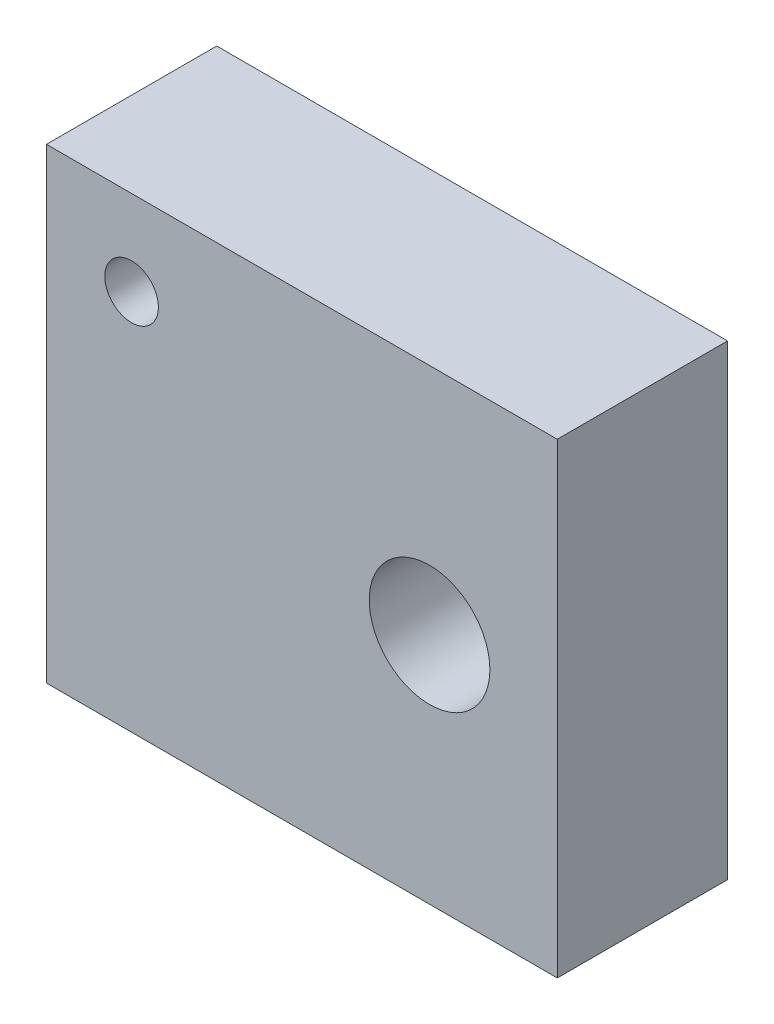
ISO-10303-21;
HEADER;
FILE_DESCRIPTION(('STEP AP214'),'2;1');
FILE_NAME('part.step','',(''),(''),'','','');
FILE_SCHEMA(('AUTOMOTIVE_DESIGN { 1 0 10303 214 1 1 1 1 }'));
ENDSEC;
DATA;
#1=APPLICATION_CONTEXT('core data for automotive mechanical design processes');
#2=APPLICATION_PROTOCOL_DEFINITION('international standard','automotive_design',2000,#1);
#3=PRODUCT_CONTEXT('',#1,'mechanical');
#4=PRODUCT('Part','Part','',(#3));
#5=PRODUCT_RELATED_PRODUCT_CATEGORY('part','',(#4));
#6=PRODUCT_DEFINITION_FORMATION('','',#4);
#7=PRODUCT_DEFINITION_CONTEXT('part definition',#1,'design');
#8=PRODUCT_DEFINITION('design','',#6,#7);
#9=PRODUCT_DEFINITION_SHAPE('','',#8);
#10=(LENGTH_UNIT() NAMED_UNIT(*) SI_UNIT(.MILLI.,.METRE.));
#11=(NAMED_UNIT(*) PLANE_ANGLE_UNIT() SI_UNIT($,.RADIAN.));
#12=(NAMED_UNIT(*) SI_UNIT($,.STERADIAN.) SOLID_ANGLE_UNIT());
#13=UNCERTAINTY_MEASURE_WITH_UNIT(LENGTH_MEASURE(1.E-05),#10,'distance_accuracy_value','');
#14=(GEOMETRIC_REPRESENTATION_CONTEXT(3) GLOBAL_UNCERTAINTY_ASSIGNED_CONTEXT((#13)) GLOBAL_UNIT_ASSIGNED_CONTEXT((#10,
#11,#12)) REPRESENTATION_CONTEXT('',''));
#15=CARTESIAN_POINT('',(0.,0.,0.));
#16=DIRECTION('',(0.,0.,1.));
#17=DIRECTION('',(1.,0.,0.));
#18=AXIS2_PLACEMENT_3D('',#15,#16,#17);
#19=CARTESIAN_POINT('',(0.,0.,6.35));
#20=DIRECTION('',(1.,0.,0.));
#21=DIRECTION('',(0.,0.,-1.));
#22=AXIS2_PLACEMENT_3D('',#19,#20,#21);
#23=PLANE('',#22);
#24=DIRECTION('',(0.,-1.,0.));
#25=VECTOR('',#24,1.);
#26=CARTESIAN_POINT('',(0.,0.,0.));
#27=LINE('',#26,#25);
#28=CARTESIAN_POINT('',(0.,17.4,0.));
#29=VERTEX_POINT('',#28);
#30=CARTESIAN_POINT('',(0.,0.,0.));
#31=VERTEX_POINT('',#30);
#32=EDGE_CURVE('E95',#29,#31,#27,.T.);
#33=ORIENTED_EDGE('',*,*,#32,.T.);
#34=DIRECTION('',(0.,0.,-1.));
#35=VECTOR('',#34,1.);
#36=CARTESIAN_POINT('',(0.,0.,6.35));
#37=LINE('',#36,#35);
#38=CARTESIAN_POINT('',(0.,0.,6.35));
#39=VERTEX_POINT('',#38);
#40=EDGE_CURVE('E11',#39,#31,#37,.T.);
#41=ORIENTED_EDGE('',*,*,#40,.F.);
#42=DIRECTION('',(0.,-1.,0.));
#43=VECTOR('',#42,1.);
#44=CARTESIAN_POINT('',(0.,0.,6.35));
#45=LINE('',#44,#43);
#46=CARTESIAN_POINT('',(0.,17.4,6.35));
#47=VERTEX_POINT('',#46);
#48=EDGE_CURVE('E83',#47,#39,#45,.T.);
#49=ORIENTED_EDGE('',*,*,#48,.F.);
#50=DIRECTION('',(0.,0.,-1.));
#51=VECTOR('',#50,1.);
#52=CARTESIAN_POINT('',(0.,17.4,6.35));
#53=LINE('',#52,#51);
#54=EDGE_CURVE('E91',#47,#29,#53,.T.);
#55=ORIENTED_EDGE('',*,*,#54,.T.);
#56=EDGE_LOOP('',(#33,#41,#49,#55));
#57=FACE_BOUND('',#56,.T.);
#58=ADVANCED_FACE('F32',(#57),#23,.F.);
#59=CARTESIAN_POINT('',(0.,0.,6.35));
#60=DIRECTION('',(0.,1.,0.));
#61=DIRECTION('',(0.,0.,1.));
#62=AXIS2_PLACEMENT_3D('',#59,#60,#61);
#63=PLANE('',#62);
#64=DIRECTION('',(1.,0.,0.));
#65=VECTOR('',#64,1.);
#66=CARTESIAN_POINT('',(0.,0.,0.));
#67=LINE('',#66,#65);
#68=CARTESIAN_POINT('',(19.05,0.,0.));
#69=VERTEX_POINT('',#68);
#70=EDGE_CURVE('E87',#31,#69,#67,.T.);
#71=ORIENTED_EDGE('',*,*,#70,.T.);
#72=DIRECTION('',(0.,0.,-1.));
#73=VECTOR('',#72,1.);
#74=CARTESIAN_POINT('',(19.05,0.,6.35));
#75=LINE('',#74,#73);
#76=CARTESIAN_POINT('',(19.05,0.,6.35));
#77=VERTEX_POINT('',#76);
#78=EDGE_CURVE('E40',#77,#69,#75,.T.);
#79=ORIENTED_EDGE('',*,*,#78,.F.);
#80=DIRECTION('',(1.,0.,0.));
#81=VECTOR('',#80,1.);
#82=CARTESIAN_POINT('',(0.,0.,6.35));
#83=LINE('',#82,#81);
#84=EDGE_CURVE('E78',#39,#77,#83,.T.);
#85=ORIENTED_EDGE('',*,*,#84,.F.);
#86=ORIENTED_EDGE('',*,*,#40,.T.);
#87=EDGE_LOOP('',(#71,#79,#85,#86));
#88=FACE_BOUND('',#87,.T.);
#89=ADVANCED_FACE('F86',(#88),#63,.F.);
#90=CARTESIAN_POINT('',(19.05,0.,6.35));
#91=DIRECTION('',(-1.,0.,0.));
#92=DIRECTION('',(0.,0.,1.));
#93=AXIS2_PLACEMENT_3D('',#90,#91,#92);
#94=PLANE('',#93);
#95=DIRECTION('',(0.,1.,0.));
#96=VECTOR('',#95,1.);
#97=CARTESIAN_POINT('',(19.05,0.,0.));
#98=LINE('',#97,#96);
#99=CARTESIAN_POINT('',(19.05,17.4,0.));
#100=VERTEX_POINT('',#99);
#101=EDGE_CURVE('E65',#69,#100,#98,.T.);
#102=ORIENTED_EDGE('',*,*,#101,.T.);
#103=DIRECTION('',(0.,0.,-1.));
#104=VECTOR('',#103,1.);
#105=CARTESIAN_POINT('',(19.05,17.4,6.35));
#106=LINE('',#105,#104);
#107=CARTESIAN_POINT('',(19.05,17.4,6.35));
#108=VERTEX_POINT('',#107);
#109=EDGE_CURVE('E88',#108,#100,#106,.T.);
#110=ORIENTED_EDGE('',*,*,#109,.F.);
#111=DIRECTION('',(0.,1.,0.));
#112=VECTOR('',#111,1.);
#113=CARTESIAN_POINT('',(19.05,0.,6.35));
#114=LINE('',#113,#112);
#115=EDGE_CURVE('E81',#77,#108,#114,.T.);
#116=ORIENTED_EDGE('',*,*,#115,.F.);
#117=ORIENTED_EDGE('',*,*,#78,.T.);
#118=EDGE_LOOP('',(#102,#110,#116,#117));
#119=FACE_BOUND('',#118,.T.);
#120=ADVANCED_FACE('F89',(#119),#94,.F.);
#121=CARTESIAN_POINT('',(0.,17.4,6.35));
#122=DIRECTION('',(0.,-1.,0.));
#123=DIRECTION('',(0.,0.,-1.));
#124=AXIS2_PLACEMENT_3D('',#121,#122,#123);
#125=PLANE('',#124);
#126=DIRECTION('',(-1.,0.,0.));
#127=VECTOR('',#126,1.);
#128=CARTESIAN_POINT('',(0.,17.4,0.));
#129=LINE('',#128,#127);
#130=EDGE_CURVE('E71',#100,#29,#129,.T.);
#131=ORIENTED_EDGE('',*,*,#130,.T.);
#132=ORIENTED_EDGE('',*,*,#54,.F.);
#133=DIRECTION('',(-1.,0.,0.));
#134=VECTOR('',#133,1.);
#135=CARTESIAN_POINT('',(0.,17.4,6.35));
#136=LINE('',#135,#134);
#137=EDGE_CURVE('E48',#108,#47,#136,.T.);
#138=ORIENTED_EDGE('',*,*,#137,.F.);
#139=ORIENTED_EDGE('',*,*,#109,.T.);
#140=EDGE_LOOP('',(#131,#132,#138,#139));
#141=FACE_BOUND('',#140,.T.);
#142=ADVANCED_FACE('F103',(#141),#125,.F.);
#143=CARTESIAN_POINT('',(0.,17.4,6.35));
#144=DIRECTION('',(0.,0.,-1.));
#145=DIRECTION('',(-1.,0.,0.));
#146=AXIS2_PLACEMENT_3D('',#143,#144,#145);
#147=PLANE('',#146);
#148=CARTESIAN_POINT('',(3.175,14.225,6.35));
#149=DIRECTION('',(0.,0.,1.));
#150=DIRECTION('',(1.,0.,0.));
#151=AXIS2_PLACEMENT_3D('',#148,#149,#150);
#152=CIRCLE('',#151,1.);
#153=CARTESIAN_POINT('',(4.175,14.225,6.35));
#154=VERTEX_POINT('',#153);
#155=EDGE_CURVE('E115',#154,#154,#152,.T.);
#156=ORIENTED_EDGE('',*,*,#155,.F.);
#157=EDGE_LOOP('',(#156));
#158=FACE_BOUND('',#157,.T.);
#159=CARTESIAN_POINT('',(14.2875,8.7,6.35));
#160=DIRECTION('',(0.,0.,1.));
#161=DIRECTION('',(1.,0.,0.));
#162=AXIS2_PLACEMENT_3D('',#159,#160,#161);
#163=CIRCLE('',#162,2.24999999999999);
#164=CARTESIAN_POINT('',(16.5375,8.7,6.35));
#165=VERTEX_POINT('',#164);
#166=EDGE_CURVE('E111',#165,#165,#163,.T.);
#167=ORIENTED_EDGE('',*,*,#166,.F.);
#168=EDGE_LOOP('',(#167));
#169=FACE_BOUND('',#168,.T.);
#170=ORIENTED_EDGE('',*,*,#48,.T.);
#171=ORIENTED_EDGE('',*,*,#84,.T.);
#172=ORIENTED_EDGE('',*,*,#115,.T.);
#173=ORIENTED_EDGE('',*,*,#137,.T.);
#174=EDGE_LOOP('',(#170,#171,#172,#173));
#175=FACE_BOUND('',#174,.T.);
#176=ADVANCED_FACE('F79',(#158,#169,#175),#147,.F.);
#177=CARTESIAN_POINT('',(0.,17.4,0.));
#178=DIRECTION('',(0.,0.,-1.));
#179=DIRECTION('',(-1.,0.,0.));
#180=AXIS2_PLACEMENT_3D('',#177,#178,#179);
#181=PLANE('',#180);
#182=CARTESIAN_POINT('',(3.175,14.225,0.));
#183=DIRECTION('',(0.,0.,1.));
#184=DIRECTION('',(1.,0.,0.));
#185=AXIS2_PLACEMENT_3D('',#182,#183,#184);
#186=CIRCLE('',#185,1.);
#187=CARTESIAN_POINT('',(4.175,14.225,0.));
#188=VERTEX_POINT('',#187);
#189=EDGE_CURVE('E114',#188,#188,#186,.T.);
#190=ORIENTED_EDGE('',*,*,#189,.T.);
#191=EDGE_LOOP('',(#190));
#192=FACE_BOUND('',#191,.T.);
#193=CARTESIAN_POINT('',(14.2875,8.7,0.));
#194=DIRECTION('',(0.,0.,-1.));
#195=DIRECTION('',(-1.,0.,0.));
#196=AXIS2_PLACEMENT_3D('',#193,#194,#195);
#197=CIRCLE('',#196,2.24999999999999);
#198=CARTESIAN_POINT('',(12.0375,8.7,0.));
#199=VERTEX_POINT('',#198);
#200=EDGE_CURVE('E98',#199,#199,#197,.T.);
#201=ORIENTED_EDGE('',*,*,#200,.F.);
#202=EDGE_LOOP('',(#201));
#203=FACE_BOUND('',#202,.T.);
#204=ORIENTED_EDGE('',*,*,#32,.F.);
#205=ORIENTED_EDGE('',*,*,#130,.F.);
#206=ORIENTED_EDGE('',*,*,#101,.F.);
#207=ORIENTED_EDGE('',*,*,#70,.F.);
#208=EDGE_LOOP('',(#204,#205,#206,#207));
#209=FACE_BOUND('',#208,.T.);
#210=ADVANCED_FACE('F106',(#192,#203,#209),#181,.T.);
#211=CARTESIAN_POINT('',(14.2875,8.7,6.35));
#212=DIRECTION('',(0.,0.,1.));
#213=DIRECTION('',(1.,0.,0.));
#214=AXIS2_PLACEMENT_3D('',#211,#212,#213);
#215=CYLINDRICAL_SURFACE('',#214,2.24999999999999);
#216=ORIENTED_EDGE('',*,*,#200,.T.);
#217=EDGE_LOOP('',(#216));
#218=FACE_BOUND('',#217,.T.);
#219=ORIENTED_EDGE('',*,*,#166,.T.);
#220=EDGE_LOOP('',(#219));
#221=FACE_BOUND('',#220,.T.);
#222=ADVANCED_FACE('F126',(#218,#221),#215,.F.);
#223=CARTESIAN_POINT('',(3.175,14.225,0.));
#224=DIRECTION('',(0.,0.,1.));
#225=DIRECTION('',(1.,0.,0.));
#226=AXIS2_PLACEMENT_3D('',#223,#224,#225);
#227=CYLINDRICAL_SURFACE('',#226,1.);
#228=ORIENTED_EDGE('',*,*,#189,.F.);
#229=EDGE_LOOP('',(#228));
#230=FACE_BOUND('',#229,.T.);
#231=ORIENTED_EDGE('',*,*,#155,.T.);
#232=EDGE_LOOP('',(#231));
#233=FACE_BOUND('',#232,.T.);
#234=ADVANCED_FACE('F123',(#230,#233),#227,.F.);
#235=CLOSED_SHELL('',(#58,#89,#120,#142,#176,#210,#222,#234));
#236=MANIFOLD_SOLID_BREP('B2',#235);
#237=ADVANCED_BREP_SHAPE_REPRESENTATION('',(#18,#236),#14);
#238=SHAPE_DEFINITION_REPRESENTATION(#9,#237);
ENDSEC;
END-ISO-10303-21;
